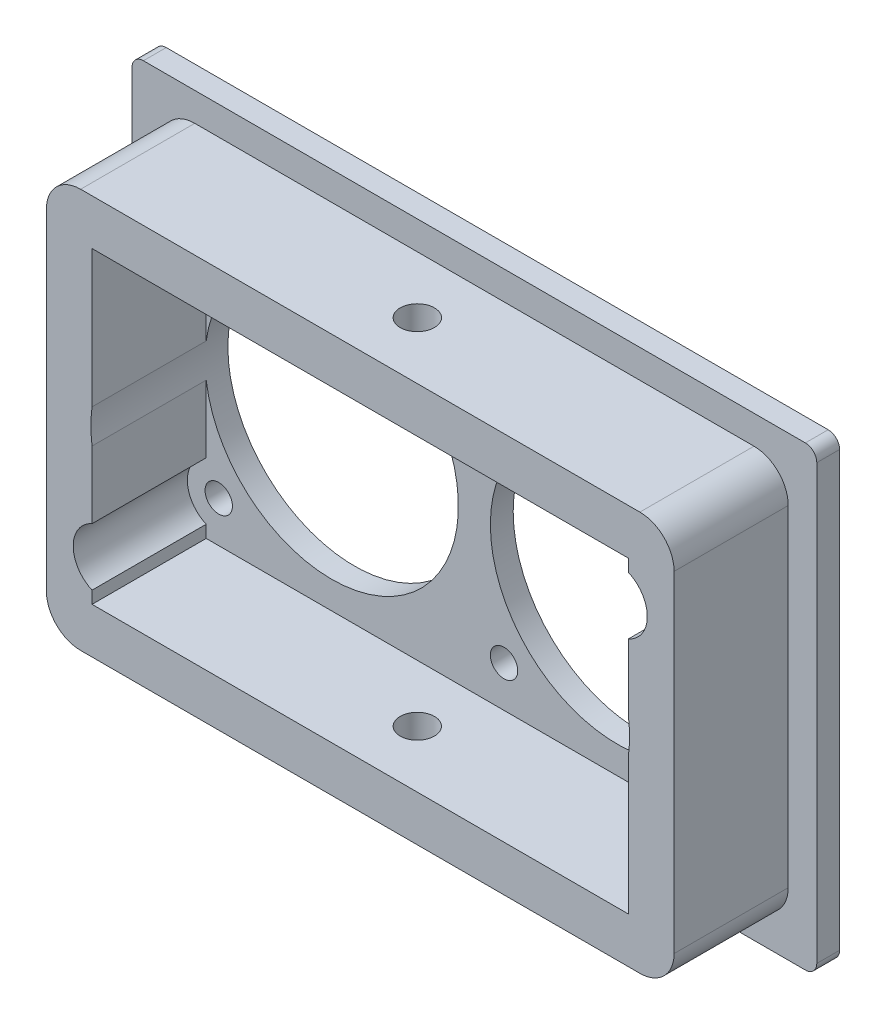
ISO-10303-21;
HEADER;
FILE_DESCRIPTION(('STEP AP214'),'2;1');
FILE_NAME('part.step','',(''),(''),'','','');
FILE_SCHEMA(('AUTOMOTIVE_DESIGN { 1 0 10303 214 1 1 1 1 }'));
ENDSEC;
DATA;
#1=APPLICATION_CONTEXT('core data for automotive mechanical design processes');
#2=APPLICATION_PROTOCOL_DEFINITION('international standard','automotive_design',2000,#1);
#3=PRODUCT_CONTEXT('',#1,'mechanical');
#4=PRODUCT('Part','Part','',(#3));
#5=PRODUCT_RELATED_PRODUCT_CATEGORY('part','',(#4));
#6=PRODUCT_DEFINITION_FORMATION('','',#4);
#7=PRODUCT_DEFINITION_CONTEXT('part definition',#1,'design');
#8=PRODUCT_DEFINITION('design','',#6,#7);
#9=PRODUCT_DEFINITION_SHAPE('','',#8);
#10=(LENGTH_UNIT() NAMED_UNIT(*) SI_UNIT(.MILLI.,.METRE.));
#11=(NAMED_UNIT(*) PLANE_ANGLE_UNIT() SI_UNIT($,.RADIAN.));
#12=(NAMED_UNIT(*) SI_UNIT($,.STERADIAN.) SOLID_ANGLE_UNIT());
#13=UNCERTAINTY_MEASURE_WITH_UNIT(LENGTH_MEASURE(1.E-05),#10,'distance_accuracy_value','');
#14=(GEOMETRIC_REPRESENTATION_CONTEXT(3) GLOBAL_UNCERTAINTY_ASSIGNED_CONTEXT((#13)) GLOBAL_UNIT_ASSIGNED_CONTEXT((#10,
#11,#12)) REPRESENTATION_CONTEXT('',''));
#15=CARTESIAN_POINT('',(0.,0.,0.));
#16=DIRECTION('',(0.,0.,1.));
#17=DIRECTION('',(1.,0.,0.));
#18=AXIS2_PLACEMENT_3D('',#15,#16,#17);
#19=CARTESIAN_POINT('',(6.5,33.5,-52.2033209314706));
#20=DIRECTION('',(-1.,0.,0.));
#21=DIRECTION('',(0.,0.,1.));
#22=AXIS2_PLACEMENT_3D('',#19,#20,#21);
#23=PLANE('',#22);
#24=DIRECTION('',(0.,0.,-1.));
#25=VECTOR('',#24,1.);
#26=CARTESIAN_POINT('',(6.5,12.6204166322257,12.));
#27=LINE('',#26,#25);
#28=CARTESIAN_POINT('',(6.5,12.6204166322257,2.));
#29=VERTEX_POINT('',#28);
#30=CARTESIAN_POINT('',(6.5,12.6204166322257,12.));
#31=VERTEX_POINT('',#30);
#32=EDGE_CURVE('E225',#29,#31,#27,.F.);
#33=ORIENTED_EDGE('',*,*,#32,.F.);
#34=DIRECTION('',(0.,-1.,0.));
#35=VECTOR('',#34,1.);
#36=CARTESIAN_POINT('',(6.5,33.5,2.));
#37=LINE('',#36,#35);
#38=CARTESIAN_POINT('',(6.5,18.5133931252681,2.));
#39=VERTEX_POINT('',#38);
#40=EDGE_CURVE('E238',#39,#29,#37,.T.);
#41=ORIENTED_EDGE('',*,*,#40,.F.);
#42=DIRECTION('',(0.,0.,-1.));
#43=VECTOR('',#42,1.);
#44=CARTESIAN_POINT('',(6.5,18.5133931252681,12.));
#45=LINE('',#44,#43);
#46=CARTESIAN_POINT('',(6.5,18.5133931252681,12.));
#47=VERTEX_POINT('',#46);
#48=EDGE_CURVE('E459',#39,#47,#45,.F.);
#49=ORIENTED_EDGE('',*,*,#48,.T.);
#50=DIRECTION('',(0.,-1.,0.));
#51=VECTOR('',#50,1.);
#52=CARTESIAN_POINT('',(6.5,33.5,12.));
#53=LINE('',#52,#51);
#54=EDGE_CURVE('E240',#47,#31,#53,.T.);
#55=ORIENTED_EDGE('',*,*,#54,.T.);
#56=EDGE_LOOP('',(#33,#41,#49,#55));
#57=FACE_BOUND('',#56,.T.);
#58=ADVANCED_FACE('F38',(#57),#23,.F.);
#59=CARTESIAN_POINT('',(53.5,6.5,-52.2033209314706));
#60=DIRECTION('',(1.,0.,0.));
#61=DIRECTION('',(0.,0.,-1.));
#62=AXIS2_PLACEMENT_3D('',#59,#60,#61);
#63=PLANE('',#62);
#64=DIRECTION('',(0.,0.,-1.));
#65=VECTOR('',#64,1.);
#66=CARTESIAN_POINT('',(53.5,27.3795833677743,12.));
#67=LINE('',#66,#65);
#68=CARTESIAN_POINT('',(53.5,27.3795833677743,2.));
#69=VERTEX_POINT('',#68);
#70=CARTESIAN_POINT('',(53.5,27.3795833677743,12.));
#71=VERTEX_POINT('',#70);
#72=EDGE_CURVE('E243',#69,#71,#67,.F.);
#73=ORIENTED_EDGE('',*,*,#72,.F.);
#74=DIRECTION('',(0.,1.,0.));
#75=VECTOR('',#74,1.);
#76=CARTESIAN_POINT('',(53.5,6.5,2.));
#77=LINE('',#76,#75);
#78=CARTESIAN_POINT('',(53.5,21.4866068747319,2.));
#79=VERTEX_POINT('',#78);
#80=EDGE_CURVE('E489',#79,#69,#77,.T.);
#81=ORIENTED_EDGE('',*,*,#80,.F.);
#82=DIRECTION('',(0.,0.,-1.));
#83=VECTOR('',#82,1.);
#84=CARTESIAN_POINT('',(53.5,21.4866068747319,12.));
#85=LINE('',#84,#83);
#86=CARTESIAN_POINT('',(53.5,21.4866068747319,12.));
#87=VERTEX_POINT('',#86);
#88=EDGE_CURVE('E446',#79,#87,#85,.F.);
#89=ORIENTED_EDGE('',*,*,#88,.T.);
#90=DIRECTION('',(0.,1.,0.));
#91=VECTOR('',#90,1.);
#92=CARTESIAN_POINT('',(53.5,6.5,12.));
#93=LINE('',#92,#91);
#94=EDGE_CURVE('E532',#87,#71,#93,.T.);
#95=ORIENTED_EDGE('',*,*,#94,.T.);
#96=EDGE_LOOP('',(#73,#81,#89,#95));
#97=FACE_BOUND('',#96,.T.);
#98=ADVANCED_FACE('F655',(#97),#63,.F.);
#99=DIRECTION('',(0.,0.,-1.));
#100=VECTOR('',#99,1.);
#101=CARTESIAN_POINT('',(6.5,7.57958336777431,12.));
#102=LINE('',#101,#100);
#103=CARTESIAN_POINT('',(6.5,7.57958336777431,12.));
#104=VERTEX_POINT('',#103);
#105=CARTESIAN_POINT('',(6.5,7.57958336777431,2.));
#106=VERTEX_POINT('',#105);
#107=EDGE_CURVE('E11',#104,#106,#102,.T.);
#108=ORIENTED_EDGE('',*,*,#107,.F.);
#109=CARTESIAN_POINT('',(6.5,6.5,12.));
#110=VERTEX_POINT('',#109);
#111=EDGE_CURVE('E521',#104,#110,#53,.T.);
#112=ORIENTED_EDGE('',*,*,#111,.T.);
#113=DIRECTION('',(0.,0.,1.));
#114=VECTOR('',#113,1.);
#115=CARTESIAN_POINT('',(6.5,6.5,-52.2033209314706));
#116=LINE('',#115,#114);
#117=CARTESIAN_POINT('',(6.5,6.5,2.));
#118=VERTEX_POINT('',#117);
#119=EDGE_CURVE('E256',#118,#110,#116,.T.);
#120=ORIENTED_EDGE('',*,*,#119,.F.);
#121=EDGE_CURVE('E252',#106,#118,#37,.T.);
#122=ORIENTED_EDGE('',*,*,#121,.F.);
#123=EDGE_LOOP('',(#108,#112,#120,#122));
#124=FACE_BOUND('',#123,.T.);
#125=ADVANCED_FACE('F594',(#124),#23,.F.);
#126=DIRECTION('',(0.,0.,-1.));
#127=VECTOR('',#126,1.);
#128=CARTESIAN_POINT('',(53.5,32.4204166322257,12.));
#129=LINE('',#128,#127);
#130=CARTESIAN_POINT('',(53.5,32.4204166322257,12.));
#131=VERTEX_POINT('',#130);
#132=CARTESIAN_POINT('',(53.5,32.4204166322257,2.));
#133=VERTEX_POINT('',#132);
#134=EDGE_CURVE('E47',#131,#133,#129,.T.);
#135=ORIENTED_EDGE('',*,*,#134,.F.);
#136=CARTESIAN_POINT('',(53.5,33.5,12.));
#137=VERTEX_POINT('',#136);
#138=EDGE_CURVE('E533',#131,#137,#93,.T.);
#139=ORIENTED_EDGE('',*,*,#138,.T.);
#140=DIRECTION('',(0.,0.,1.));
#141=VECTOR('',#140,1.);
#142=CARTESIAN_POINT('',(53.5,33.5,-52.2033209314706));
#143=LINE('',#142,#141);
#144=CARTESIAN_POINT('',(53.5,33.5,2.));
#145=VERTEX_POINT('',#144);
#146=EDGE_CURVE('E273',#145,#137,#143,.T.);
#147=ORIENTED_EDGE('',*,*,#146,.F.);
#148=EDGE_CURVE('E266',#133,#145,#77,.T.);
#149=ORIENTED_EDGE('',*,*,#148,.F.);
#150=EDGE_LOOP('',(#135,#139,#147,#149));
#151=FACE_BOUND('',#150,.T.);
#152=ADVANCED_FACE('F493',(#151),#63,.F.);
#153=CARTESIAN_POINT('',(52.4,29.9,12.));
#154=DIRECTION('',(0.,0.,-1.));
#155=DIRECTION('',(-1.,0.,0.));
#156=AXIS2_PLACEMENT_3D('',#153,#154,#155);
#157=CYLINDRICAL_SURFACE('',#156,1.2);
#158=CARTESIAN_POINT('',(52.4,29.9,0.));
#159=DIRECTION('',(0.,0.,-1.));
#160=DIRECTION('',(-1.,0.,0.));
#161=AXIS2_PLACEMENT_3D('',#158,#159,#160);
#162=CIRCLE('',#161,1.2);
#163=CARTESIAN_POINT('',(51.2,29.9,0.));
#164=VERTEX_POINT('',#163);
#165=EDGE_CURVE('E567',#164,#164,#162,.T.);
#166=ORIENTED_EDGE('',*,*,#165,.T.);
#167=EDGE_LOOP('',(#166));
#168=FACE_BOUND('',#167,.T.);
#169=CARTESIAN_POINT('',(52.4,29.9,2.));
#170=DIRECTION('',(0.,0.,-1.));
#171=DIRECTION('',(-1.,0.,0.));
#172=AXIS2_PLACEMENT_3D('',#169,#170,#171);
#173=CIRCLE('',#172,1.2);
#174=CARTESIAN_POINT('',(51.2,29.9,2.));
#175=VERTEX_POINT('',#174);
#176=EDGE_CURVE('E555',#175,#175,#173,.T.);
#177=ORIENTED_EDGE('',*,*,#176,.F.);
#178=EDGE_LOOP('',(#177));
#179=FACE_BOUND('',#178,.T.);
#180=ADVANCED_FACE('F675',(#168,#179),#157,.F.);
#181=CARTESIAN_POINT('',(7.60000000000004,10.1,12.));
#182=DIRECTION('',(0.,0.,-1.));
#183=DIRECTION('',(-1.,0.,0.));
#184=AXIS2_PLACEMENT_3D('',#181,#182,#183);
#185=CYLINDRICAL_SURFACE('',#184,1.2);
#186=CARTESIAN_POINT('',(7.60000000000004,10.1,0.));
#187=DIRECTION('',(0.,0.,-1.));
#188=DIRECTION('',(-1.,0.,0.));
#189=AXIS2_PLACEMENT_3D('',#186,#187,#188);
#190=CIRCLE('',#189,1.2);
#191=CARTESIAN_POINT('',(6.40000000000004,10.1,0.));
#192=VERTEX_POINT('',#191);
#193=EDGE_CURVE('E242',#192,#192,#190,.T.);
#194=ORIENTED_EDGE('',*,*,#193,.T.);
#195=EDGE_LOOP('',(#194));
#196=FACE_BOUND('',#195,.T.);
#197=CARTESIAN_POINT('',(7.60000000000004,10.1,2.));
#198=DIRECTION('',(0.,0.,-1.));
#199=DIRECTION('',(-1.,0.,0.));
#200=AXIS2_PLACEMENT_3D('',#197,#198,#199);
#201=CIRCLE('',#200,1.2);
#202=CARTESIAN_POINT('',(6.40000000000004,10.1,2.));
#203=VERTEX_POINT('',#202);
#204=EDGE_CURVE('E551',#203,#203,#201,.T.);
#205=ORIENTED_EDGE('',*,*,#204,.F.);
#206=EDGE_LOOP('',(#205));
#207=FACE_BOUND('',#206,.T.);
#208=ADVANCED_FACE('F668',(#196,#207),#185,.F.);
#209=CARTESIAN_POINT('',(6.5,33.5,12.));
#210=VERTEX_POINT('',#209);
#211=CARTESIAN_POINT('',(6.5,21.4866068747319,12.));
#212=VERTEX_POINT('',#211);
#213=EDGE_CURVE('E515',#210,#212,#53,.T.);
#214=ORIENTED_EDGE('',*,*,#213,.T.);
#215=DIRECTION('',(0.,0.,-1.));
#216=VECTOR('',#215,1.);
#217=CARTESIAN_POINT('',(6.5,21.4866068747319,12.));
#218=LINE('',#217,#216);
#219=CARTESIAN_POINT('',(6.5,21.4866068747319,2.));
#220=VERTEX_POINT('',#219);
#221=EDGE_CURVE('E462',#212,#220,#218,.T.);
#222=ORIENTED_EDGE('',*,*,#221,.T.);
#223=CARTESIAN_POINT('',(6.5,33.5,2.));
#224=VERTEX_POINT('',#223);
#225=EDGE_CURVE('E251',#224,#220,#37,.T.);
#226=ORIENTED_EDGE('',*,*,#225,.F.);
#227=DIRECTION('',(0.,0.,1.));
#228=VECTOR('',#227,1.);
#229=CARTESIAN_POINT('',(6.5,33.5,-52.2033209314706));
#230=LINE('',#229,#228);
#231=EDGE_CURVE('E257',#224,#210,#230,.T.);
#232=ORIENTED_EDGE('',*,*,#231,.T.);
#233=EDGE_LOOP('',(#214,#222,#226,#232));
#234=FACE_BOUND('',#233,.T.);
#235=ADVANCED_FACE('F657',(#234),#23,.F.);
#236=CARTESIAN_POINT('',(53.5,6.5,12.));
#237=VERTEX_POINT('',#236);
#238=CARTESIAN_POINT('',(53.5,18.5133931252681,12.));
#239=VERTEX_POINT('',#238);
#240=EDGE_CURVE('E530',#237,#239,#93,.T.);
#241=ORIENTED_EDGE('',*,*,#240,.T.);
#242=DIRECTION('',(0.,0.,-1.));
#243=VECTOR('',#242,1.);
#244=CARTESIAN_POINT('',(53.5,18.5133931252681,12.));
#245=LINE('',#244,#243);
#246=CARTESIAN_POINT('',(53.5,18.5133931252681,2.));
#247=VERTEX_POINT('',#246);
#248=EDGE_CURVE('E455',#239,#247,#245,.T.);
#249=ORIENTED_EDGE('',*,*,#248,.T.);
#250=CARTESIAN_POINT('',(53.5,6.5,2.));
#251=VERTEX_POINT('',#250);
#252=EDGE_CURVE('E278',#251,#247,#77,.T.);
#253=ORIENTED_EDGE('',*,*,#252,.F.);
#254=DIRECTION('',(0.,0.,1.));
#255=VECTOR('',#254,1.);
#256=CARTESIAN_POINT('',(53.5,6.5,-52.2033209314706));
#257=LINE('',#256,#255);
#258=EDGE_CURVE('E262',#251,#237,#257,.T.);
#259=ORIENTED_EDGE('',*,*,#258,.T.);
#260=EDGE_LOOP('',(#241,#249,#253,#259));
#261=FACE_BOUND('',#260,.T.);
#262=ADVANCED_FACE('F505',(#261),#63,.F.);
#263=CARTESIAN_POINT('',(0.,0.,2.));
#264=DIRECTION('',(0.,0.,-1.));
#265=DIRECTION('',(-1.,0.,0.));
#266=AXIS2_PLACEMENT_3D('',#263,#264,#265);
#267=PLANE('',#266);
#268=DIRECTION('',(0.,-1.,0.));
#269=VECTOR('',#268,1.);
#270=CARTESIAN_POINT('',(0.,0.,2.));
#271=LINE('',#270,#269);
#272=CARTESIAN_POINT('',(0.,39.,2.));
#273=VERTEX_POINT('',#272);
#274=CARTESIAN_POINT('',(0.,1.,2.));
#275=VERTEX_POINT('',#274);
#276=EDGE_CURVE('E311',#273,#275,#271,.T.);
#277=ORIENTED_EDGE('',*,*,#276,.T.);
#278=CARTESIAN_POINT('',(1.,1.,2.));
#279=DIRECTION('',(0.,0.,-1.));
#280=DIRECTION('',(-1.,0.,0.));
#281=AXIS2_PLACEMENT_3D('',#278,#279,#280);
#282=CIRCLE('',#281,1.);
#283=CARTESIAN_POINT('',(1.,0.,2.));
#284=VERTEX_POINT('',#283);
#285=EDGE_CURVE('E429',#275,#284,#282,.F.);
#286=ORIENTED_EDGE('',*,*,#285,.T.);
#287=DIRECTION('',(1.,0.,0.));
#288=VECTOR('',#287,1.);
#289=CARTESIAN_POINT('',(0.,0.,2.));
#290=LINE('',#289,#288);
#291=CARTESIAN_POINT('',(59.,0.,2.));
#292=VERTEX_POINT('',#291);
#293=EDGE_CURVE('E315',#284,#292,#290,.T.);
#294=ORIENTED_EDGE('',*,*,#293,.T.);
#295=CARTESIAN_POINT('',(59.,1.,2.));
#296=DIRECTION('',(0.,0.,-1.));
#297=DIRECTION('',(-1.,0.,0.));
#298=AXIS2_PLACEMENT_3D('',#295,#296,#297);
#299=CIRCLE('',#298,1.);
#300=CARTESIAN_POINT('',(60.,1.,2.));
#301=VERTEX_POINT('',#300);
#302=EDGE_CURVE('E426',#292,#301,#299,.F.);
#303=ORIENTED_EDGE('',*,*,#302,.T.);
#304=DIRECTION('',(0.,1.,0.));
#305=VECTOR('',#304,1.);
#306=CARTESIAN_POINT('',(60.,0.,2.));
#307=LINE('',#306,#305);
#308=CARTESIAN_POINT('',(60.,39.,2.));
#309=VERTEX_POINT('',#308);
#310=EDGE_CURVE('E320',#301,#309,#307,.T.);
#311=ORIENTED_EDGE('',*,*,#310,.T.);
#312=CARTESIAN_POINT('',(59.,39.,2.));
#313=DIRECTION('',(0.,0.,-1.));
#314=DIRECTION('',(-1.,0.,0.));
#315=AXIS2_PLACEMENT_3D('',#312,#313,#314);
#316=CIRCLE('',#315,1.);
#317=CARTESIAN_POINT('',(59.,40.,2.));
#318=VERTEX_POINT('',#317);
#319=EDGE_CURVE('E423',#309,#318,#316,.F.);
#320=ORIENTED_EDGE('',*,*,#319,.T.);
#321=DIRECTION('',(-1.,0.,0.));
#322=VECTOR('',#321,1.);
#323=CARTESIAN_POINT('',(0.,40.,2.));
#324=LINE('',#323,#322);
#325=CARTESIAN_POINT('',(1.,40.,2.));
#326=VERTEX_POINT('',#325);
#327=EDGE_CURVE('E324',#318,#326,#324,.T.);
#328=ORIENTED_EDGE('',*,*,#327,.T.);
#329=CARTESIAN_POINT('',(1.,39.,2.));
#330=DIRECTION('',(0.,0.,-1.));
#331=DIRECTION('',(-1.,0.,0.));
#332=AXIS2_PLACEMENT_3D('',#329,#330,#331);
#333=CIRCLE('',#332,1.);
#334=EDGE_CURVE('E420',#326,#273,#333,.F.);
#335=ORIENTED_EDGE('',*,*,#334,.T.);
#336=EDGE_LOOP('',(#277,#286,#294,#303,#311,#320,#328,#335));
#337=FACE_BOUND('',#336,.T.);
#338=DIRECTION('',(-1.,0.,0.));
#339=VECTOR('',#338,1.);
#340=CARTESIAN_POINT('',(57.5,37.5,2.));
#341=LINE('',#340,#339);
#342=CARTESIAN_POINT('',(54.5,37.5,2.));
#343=VERTEX_POINT('',#342);
#344=CARTESIAN_POINT('',(5.5,37.5,2.));
#345=VERTEX_POINT('',#344);
#346=EDGE_CURVE('E277',#343,#345,#341,.T.);
#347=ORIENTED_EDGE('',*,*,#346,.F.);
#348=CARTESIAN_POINT('',(54.5,34.5,2.));
#349=DIRECTION('',(0.,0.,-1.));
#350=DIRECTION('',(-1.,0.,0.));
#351=AXIS2_PLACEMENT_3D('',#348,#349,#350);
#352=CIRCLE('',#351,3.);
#353=CARTESIAN_POINT('',(57.5,34.5,2.));
#354=VERTEX_POINT('',#353);
#355=EDGE_CURVE('E391',#343,#354,#352,.T.);
#356=ORIENTED_EDGE('',*,*,#355,.T.);
#357=DIRECTION('',(0.,1.,0.));
#358=VECTOR('',#357,1.);
#359=CARTESIAN_POINT('',(57.5,2.5,2.));
#360=LINE('',#359,#358);
#361=CARTESIAN_POINT('',(57.5,5.5,2.));
#362=VERTEX_POINT('',#361);
#363=EDGE_CURVE('E284',#362,#354,#360,.T.);
#364=ORIENTED_EDGE('',*,*,#363,.F.);
#365=CARTESIAN_POINT('',(54.5,5.5,2.));
#366=DIRECTION('',(0.,0.,-1.));
#367=DIRECTION('',(-1.,0.,0.));
#368=AXIS2_PLACEMENT_3D('',#365,#366,#367);
#369=CIRCLE('',#368,3.);
#370=CARTESIAN_POINT('',(54.5,2.5,2.));
#371=VERTEX_POINT('',#370);
#372=EDGE_CURVE('E388',#362,#371,#369,.T.);
#373=ORIENTED_EDGE('',*,*,#372,.T.);
#374=DIRECTION('',(1.,0.,0.));
#375=VECTOR('',#374,1.);
#376=CARTESIAN_POINT('',(2.5,2.5,2.));
#377=LINE('',#376,#375);
#378=CARTESIAN_POINT('',(5.5,2.5,2.));
#379=VERTEX_POINT('',#378);
#380=EDGE_CURVE('E304',#379,#371,#377,.T.);
#381=ORIENTED_EDGE('',*,*,#380,.F.);
#382=CARTESIAN_POINT('',(5.5,5.5,2.));
#383=DIRECTION('',(0.,0.,-1.));
#384=DIRECTION('',(-1.,0.,0.));
#385=AXIS2_PLACEMENT_3D('',#382,#383,#384);
#386=CIRCLE('',#385,3.);
#387=CARTESIAN_POINT('',(2.5,5.5,2.));
#388=VERTEX_POINT('',#387);
#389=EDGE_CURVE('E385',#379,#388,#386,.T.);
#390=ORIENTED_EDGE('',*,*,#389,.T.);
#391=DIRECTION('',(0.,-1.,0.));
#392=VECTOR('',#391,1.);
#393=CARTESIAN_POINT('',(2.5,37.5,2.));
#394=LINE('',#393,#392);
#395=CARTESIAN_POINT('',(2.5,34.5,2.));
#396=VERTEX_POINT('',#395);
#397=EDGE_CURVE('E300',#396,#388,#394,.T.);
#398=ORIENTED_EDGE('',*,*,#397,.F.);
#399=CARTESIAN_POINT('',(5.5,34.5,2.));
#400=DIRECTION('',(0.,0.,-1.));
#401=DIRECTION('',(-1.,0.,0.));
#402=AXIS2_PLACEMENT_3D('',#399,#400,#401);
#403=CIRCLE('',#402,3.);
#404=EDGE_CURVE('E382',#396,#345,#403,.T.);
#405=ORIENTED_EDGE('',*,*,#404,.T.);
#406=EDGE_LOOP('',(#347,#356,#364,#373,#381,#390,#398,#405));
#407=FACE_BOUND('',#406,.T.);
#408=ADVANCED_FACE('F618',(#337,#407),#267,.F.);
#409=CARTESIAN_POINT('',(0.,0.,2.));
#410=DIRECTION('',(1.,0.,0.));
#411=DIRECTION('',(0.,0.,-1.));
#412=AXIS2_PLACEMENT_3D('',#409,#410,#411);
#413=PLANE('',#412);
#414=DIRECTION('',(0.,-1.,0.));
#415=VECTOR('',#414,1.);
#416=CARTESIAN_POINT('',(0.,0.,0.));
#417=LINE('',#416,#415);
#418=CARTESIAN_POINT('',(0.,39.,0.));
#419=VERTEX_POINT('',#418);
#420=CARTESIAN_POINT('',(0.,1.,0.));
#421=VERTEX_POINT('',#420);
#422=EDGE_CURVE('E296',#419,#421,#417,.T.);
#423=ORIENTED_EDGE('',*,*,#422,.T.);
#424=DIRECTION('',(0.,0.,-1.));
#425=VECTOR('',#424,1.);
#426=CARTESIAN_POINT('',(0.,1.,2.));
#427=LINE('',#426,#425);
#428=EDGE_CURVE('E417',#421,#275,#427,.F.);
#429=ORIENTED_EDGE('',*,*,#428,.T.);
#430=ORIENTED_EDGE('',*,*,#276,.F.);
#431=DIRECTION('',(0.,0.,-1.));
#432=VECTOR('',#431,1.);
#433=CARTESIAN_POINT('',(0.,39.,2.));
#434=LINE('',#433,#432);
#435=EDGE_CURVE('E413',#273,#419,#434,.T.);
#436=ORIENTED_EDGE('',*,*,#435,.T.);
#437=EDGE_LOOP('',(#423,#429,#430,#436));
#438=FACE_BOUND('',#437,.T.);
#439=ADVANCED_FACE('F787',(#438),#413,.F.);
#440=CARTESIAN_POINT('',(0.,0.,2.));
#441=DIRECTION('',(0.,1.,0.));
#442=DIRECTION('',(0.,0.,1.));
#443=AXIS2_PLACEMENT_3D('',#440,#441,#442);
#444=PLANE('',#443);
#445=ORIENTED_EDGE('',*,*,#293,.F.);
#446=DIRECTION('',(0.,0.,-1.));
#447=VECTOR('',#446,1.);
#448=CARTESIAN_POINT('',(1.,0.,2.));
#449=LINE('',#448,#447);
#450=CARTESIAN_POINT('',(1.,0.,0.));
#451=VERTEX_POINT('',#450);
#452=EDGE_CURVE('E397',#284,#451,#449,.T.);
#453=ORIENTED_EDGE('',*,*,#452,.T.);
#454=DIRECTION('',(1.,0.,0.));
#455=VECTOR('',#454,1.);
#456=CARTESIAN_POINT('',(0.,0.,0.));
#457=LINE('',#456,#455);
#458=CARTESIAN_POINT('',(59.,0.,0.));
#459=VERTEX_POINT('',#458);
#460=EDGE_CURVE('E332',#451,#459,#457,.T.);
#461=ORIENTED_EDGE('',*,*,#460,.T.);
#462=DIRECTION('',(0.,0.,-1.));
#463=VECTOR('',#462,1.);
#464=CARTESIAN_POINT('',(59.,0.,2.));
#465=LINE('',#464,#463);
#466=EDGE_CURVE('E394',#459,#292,#465,.F.);
#467=ORIENTED_EDGE('',*,*,#466,.T.);
#468=EDGE_LOOP('',(#445,#453,#461,#467));
#469=FACE_BOUND('',#468,.T.);
#470=ADVANCED_FACE('F808',(#469),#444,.F.);
#471=CARTESIAN_POINT('',(60.,0.,2.));
#472=DIRECTION('',(-1.,0.,0.));
#473=DIRECTION('',(0.,0.,1.));
#474=AXIS2_PLACEMENT_3D('',#471,#472,#473);
#475=PLANE('',#474);
#476=ORIENTED_EDGE('',*,*,#310,.F.);
#477=DIRECTION('',(0.,0.,-1.));
#478=VECTOR('',#477,1.);
#479=CARTESIAN_POINT('',(60.,1.,2.));
#480=LINE('',#479,#478);
#481=CARTESIAN_POINT('',(60.,1.,0.));
#482=VERTEX_POINT('',#481);
#483=EDGE_CURVE('E435',#301,#482,#480,.T.);
#484=ORIENTED_EDGE('',*,*,#483,.T.);
#485=DIRECTION('',(0.,1.,0.));
#486=VECTOR('',#485,1.);
#487=CARTESIAN_POINT('',(60.,0.,0.));
#488=LINE('',#487,#486);
#489=CARTESIAN_POINT('',(60.,39.,0.));
#490=VERTEX_POINT('',#489);
#491=EDGE_CURVE('E336',#482,#490,#488,.T.);
#492=ORIENTED_EDGE('',*,*,#491,.T.);
#493=DIRECTION('',(0.,0.,-1.));
#494=VECTOR('',#493,1.);
#495=CARTESIAN_POINT('',(60.,39.,2.));
#496=LINE('',#495,#494);
#497=EDGE_CURVE('E432',#490,#309,#496,.F.);
#498=ORIENTED_EDGE('',*,*,#497,.T.);
#499=EDGE_LOOP('',(#476,#484,#492,#498));
#500=FACE_BOUND('',#499,.T.);
#501=ADVANCED_FACE('F799',(#500),#475,.F.);
#502=CARTESIAN_POINT('',(0.,40.,2.));
#503=DIRECTION('',(0.,-1.,0.));
#504=DIRECTION('',(0.,0.,-1.));
#505=AXIS2_PLACEMENT_3D('',#502,#503,#504);
#506=PLANE('',#505);
#507=ORIENTED_EDGE('',*,*,#327,.F.);
#508=DIRECTION('',(0.,0.,-1.));
#509=VECTOR('',#508,1.);
#510=CARTESIAN_POINT('',(59.,40.,2.));
#511=LINE('',#510,#509);
#512=CARTESIAN_POINT('',(59.,40.,0.));
#513=VERTEX_POINT('',#512);
#514=EDGE_CURVE('E442',#318,#513,#511,.T.);
#515=ORIENTED_EDGE('',*,*,#514,.T.);
#516=DIRECTION('',(-1.,0.,0.));
#517=VECTOR('',#516,1.);
#518=CARTESIAN_POINT('',(0.,40.,0.));
#519=LINE('',#518,#517);
#520=CARTESIAN_POINT('',(1.,40.,0.));
#521=VERTEX_POINT('',#520);
#522=EDGE_CURVE('E316',#513,#521,#519,.T.);
#523=ORIENTED_EDGE('',*,*,#522,.T.);
#524=DIRECTION('',(0.,0.,-1.));
#525=VECTOR('',#524,1.);
#526=CARTESIAN_POINT('',(1.,40.,2.));
#527=LINE('',#526,#525);
#528=EDGE_CURVE('E439',#521,#326,#527,.F.);
#529=ORIENTED_EDGE('',*,*,#528,.T.);
#530=EDGE_LOOP('',(#507,#515,#523,#529));
#531=FACE_BOUND('',#530,.T.);
#532=ADVANCED_FACE('F649',(#531),#506,.F.);
#533=CARTESIAN_POINT('',(0.,0.,0.));
#534=DIRECTION('',(0.,0.,-1.));
#535=DIRECTION('',(-1.,0.,0.));
#536=AXIS2_PLACEMENT_3D('',#533,#534,#535);
#537=PLANE('',#536);
#538=CARTESIAN_POINT('',(27.4,29.9,0.));
#539=DIRECTION('',(0.,0.,-1.));
#540=DIRECTION('',(-1.,0.,0.));
#541=AXIS2_PLACEMENT_3D('',#538,#539,#540);
#542=CIRCLE('',#541,1.2);
#543=CARTESIAN_POINT('',(26.2,29.9,0.));
#544=VERTEX_POINT('',#543);
#545=EDGE_CURVE('E578',#544,#544,#542,.T.);
#546=ORIENTED_EDGE('',*,*,#545,.F.);
#547=EDGE_LOOP('',(#546));
#548=FACE_BOUND('',#547,.T.);
#549=CARTESIAN_POINT('',(32.6,10.1,0.));
#550=DIRECTION('',(0.,0.,-1.));
#551=DIRECTION('',(-1.,0.,0.));
#552=AXIS2_PLACEMENT_3D('',#549,#550,#551);
#553=CIRCLE('',#552,1.2);
#554=CARTESIAN_POINT('',(31.4,10.1,0.));
#555=VERTEX_POINT('',#554);
#556=EDGE_CURVE('E572',#555,#555,#553,.T.);
#557=ORIENTED_EDGE('',*,*,#556,.F.);
#558=EDGE_LOOP('',(#557));
#559=FACE_BOUND('',#558,.T.);
#560=ORIENTED_EDGE('',*,*,#165,.F.);
#561=EDGE_LOOP('',(#560));
#562=FACE_BOUND('',#561,.T.);
#563=CARTESIAN_POINT('',(17.5,20.,0.));
#564=DIRECTION('',(0.,0.,-1.));
#565=DIRECTION('',(-1.,0.,0.));
#566=AXIS2_PLACEMENT_3D('',#563,#564,#565);
#567=CIRCLE('',#566,11.1);
#568=CARTESIAN_POINT('',(6.4,20.,0.));
#569=VERTEX_POINT('',#568);
#570=EDGE_CURVE('E571',#569,#569,#567,.T.);
#571=ORIENTED_EDGE('',*,*,#570,.F.);
#572=EDGE_LOOP('',(#571));
#573=FACE_BOUND('',#572,.T.);
#574=ORIENTED_EDGE('',*,*,#193,.F.);
#575=EDGE_LOOP('',(#574));
#576=FACE_BOUND('',#575,.T.);
#577=CARTESIAN_POINT('',(42.5,20.,0.));
#578=DIRECTION('',(0.,0.,-1.));
#579=DIRECTION('',(-1.,0.,0.));
#580=AXIS2_PLACEMENT_3D('',#577,#578,#579);
#581=CIRCLE('',#580,11.1);
#582=CARTESIAN_POINT('',(31.4,20.,0.));
#583=VERTEX_POINT('',#582);
#584=EDGE_CURVE('E561',#583,#583,#581,.T.);
#585=ORIENTED_EDGE('',*,*,#584,.F.);
#586=EDGE_LOOP('',(#585));
#587=FACE_BOUND('',#586,.T.);
#588=ORIENTED_EDGE('',*,*,#460,.F.);
#589=CARTESIAN_POINT('',(1.,1.,0.));
#590=DIRECTION('',(0.,0.,-1.));
#591=DIRECTION('',(-1.,0.,0.));
#592=AXIS2_PLACEMENT_3D('',#589,#590,#591);
#593=CIRCLE('',#592,1.);
#594=EDGE_CURVE('E410',#451,#421,#593,.T.);
#595=ORIENTED_EDGE('',*,*,#594,.T.);
#596=ORIENTED_EDGE('',*,*,#422,.F.);
#597=CARTESIAN_POINT('',(1.,39.,0.));
#598=DIRECTION('',(0.,0.,-1.));
#599=DIRECTION('',(-1.,0.,0.));
#600=AXIS2_PLACEMENT_3D('',#597,#598,#599);
#601=CIRCLE('',#600,1.);
#602=EDGE_CURVE('E401',#419,#521,#601,.T.);
#603=ORIENTED_EDGE('',*,*,#602,.T.);
#604=ORIENTED_EDGE('',*,*,#522,.F.);
#605=CARTESIAN_POINT('',(59.,39.,0.));
#606=DIRECTION('',(0.,0.,-1.));
#607=DIRECTION('',(-1.,0.,0.));
#608=AXIS2_PLACEMENT_3D('',#605,#606,#607);
#609=CIRCLE('',#608,1.);
#610=EDGE_CURVE('E404',#513,#490,#609,.T.);
#611=ORIENTED_EDGE('',*,*,#610,.T.);
#612=ORIENTED_EDGE('',*,*,#491,.F.);
#613=CARTESIAN_POINT('',(59.,1.,0.));
#614=DIRECTION('',(0.,0.,-1.));
#615=DIRECTION('',(-1.,0.,0.));
#616=AXIS2_PLACEMENT_3D('',#613,#614,#615);
#617=CIRCLE('',#616,1.);
#618=EDGE_CURVE('E407',#482,#459,#617,.T.);
#619=ORIENTED_EDGE('',*,*,#618,.T.);
#620=EDGE_LOOP('',(#588,#595,#596,#603,#604,#611,#612,#619));
#621=FACE_BOUND('',#620,.T.);
#622=ADVANCED_FACE('F640',(#548,#559,#562,#573,#576,#587,#621),#537,.T.);
#623=CARTESIAN_POINT('',(57.5,37.5,12.));
#624=DIRECTION('',(0.,-1.,0.));
#625=DIRECTION('',(0.,0.,-1.));
#626=AXIS2_PLACEMENT_3D('',#623,#624,#625);
#627=PLANE('',#626);
#628=CARTESIAN_POINT('',(30.,37.5,7.00000000000001));
#629=DIRECTION('',(0.,1.,0.));
#630=DIRECTION('',(0.,0.,1.));
#631=AXIS2_PLACEMENT_3D('',#628,#629,#630);
#632=CIRCLE('',#631,1.5);
#633=CARTESIAN_POINT('',(30.,37.5,8.50000000000001));
#634=VERTEX_POINT('',#633);
#635=EDGE_CURVE('E452',#634,#634,#632,.T.);
#636=ORIENTED_EDGE('',*,*,#635,.F.);
#637=EDGE_LOOP('',(#636));
#638=FACE_BOUND('',#637,.T.);
#639=ORIENTED_EDGE('',*,*,#346,.T.);
#640=DIRECTION('',(0.,0.,-1.));
#641=VECTOR('',#640,1.);
#642=CARTESIAN_POINT('',(5.5,37.5,12.));
#643=LINE('',#642,#641);
#644=CARTESIAN_POINT('',(5.5,37.5,12.));
#645=VERTEX_POINT('',#644);
#646=EDGE_CURVE('E353',#345,#645,#643,.F.);
#647=ORIENTED_EDGE('',*,*,#646,.T.);
#648=DIRECTION('',(-1.,0.,0.));
#649=VECTOR('',#648,1.);
#650=CARTESIAN_POINT('',(57.5,37.5,12.));
#651=LINE('',#650,#649);
#652=CARTESIAN_POINT('',(54.5,37.5,12.));
#653=VERTEX_POINT('',#652);
#654=EDGE_CURVE('E279',#653,#645,#651,.T.);
#655=ORIENTED_EDGE('',*,*,#654,.F.);
#656=DIRECTION('',(0.,0.,-1.));
#657=VECTOR('',#656,1.);
#658=CARTESIAN_POINT('',(54.5,37.5,12.));
#659=LINE('',#658,#657);
#660=EDGE_CURVE('E349',#653,#343,#659,.T.);
#661=ORIENTED_EDGE('',*,*,#660,.T.);
#662=EDGE_LOOP('',(#639,#647,#655,#661));
#663=FACE_BOUND('',#662,.T.);
#664=ADVANCED_FACE('F638',(#638,#663),#627,.F.);
#665=CARTESIAN_POINT('',(2.5,37.5,12.));
#666=DIRECTION('',(1.,0.,0.));
#667=DIRECTION('',(0.,0.,-1.));
#668=AXIS2_PLACEMENT_3D('',#665,#666,#667);
#669=PLANE('',#668);
#670=DIRECTION('',(0.,-1.,0.));
#671=VECTOR('',#670,1.);
#672=CARTESIAN_POINT('',(2.5,37.5,12.));
#673=LINE('',#672,#671);
#674=CARTESIAN_POINT('',(2.5,34.5,12.));
#675=VERTEX_POINT('',#674);
#676=CARTESIAN_POINT('',(2.5,5.5,12.));
#677=VERTEX_POINT('',#676);
#678=EDGE_CURVE('E283',#675,#677,#673,.T.);
#679=ORIENTED_EDGE('',*,*,#678,.F.);
#680=DIRECTION('',(0.,0.,-1.));
#681=VECTOR('',#680,1.);
#682=CARTESIAN_POINT('',(2.5,34.5,12.));
#683=LINE('',#682,#681);
#684=EDGE_CURVE('E345',#675,#396,#683,.T.);
#685=ORIENTED_EDGE('',*,*,#684,.T.);
#686=ORIENTED_EDGE('',*,*,#397,.T.);
#687=DIRECTION('',(0.,0.,-1.));
#688=VECTOR('',#687,1.);
#689=CARTESIAN_POINT('',(2.5,5.5,12.));
#690=LINE('',#689,#688);
#691=EDGE_CURVE('E328',#388,#677,#690,.F.);
#692=ORIENTED_EDGE('',*,*,#691,.T.);
#693=EDGE_LOOP('',(#679,#685,#686,#692));
#694=FACE_BOUND('',#693,.T.);
#695=ADVANCED_FACE('F614',(#694),#669,.F.);
#696=CARTESIAN_POINT('',(2.5,2.5,12.));
#697=DIRECTION('',(0.,1.,0.));
#698=DIRECTION('',(0.,0.,1.));
#699=AXIS2_PLACEMENT_3D('',#696,#697,#698);
#700=PLANE('',#699);
#701=CARTESIAN_POINT('',(30.,2.5,7.00000000000001));
#702=DIRECTION('',(0.,1.,0.));
#703=DIRECTION('',(0.,0.,1.));
#704=AXIS2_PLACEMENT_3D('',#701,#702,#703);
#705=CIRCLE('',#704,1.5);
#706=CARTESIAN_POINT('',(30.,2.5,8.50000000000001));
#707=VERTEX_POINT('',#706);
#708=EDGE_CURVE('E523',#707,#707,#705,.T.);
#709=ORIENTED_EDGE('',*,*,#708,.T.);
#710=EDGE_LOOP('',(#709));
#711=FACE_BOUND('',#710,.T.);
#712=DIRECTION('',(1.,0.,0.));
#713=VECTOR('',#712,1.);
#714=CARTESIAN_POINT('',(2.5,2.5,12.));
#715=LINE('',#714,#713);
#716=CARTESIAN_POINT('',(5.5,2.5,12.));
#717=VERTEX_POINT('',#716);
#718=CARTESIAN_POINT('',(54.5,2.5,12.));
#719=VERTEX_POINT('',#718);
#720=EDGE_CURVE('E288',#717,#719,#715,.T.);
#721=ORIENTED_EDGE('',*,*,#720,.F.);
#722=DIRECTION('',(0.,0.,-1.));
#723=VECTOR('',#722,1.);
#724=CARTESIAN_POINT('',(5.5,2.5,12.));
#725=LINE('',#724,#723);
#726=EDGE_CURVE('E371',#717,#379,#725,.T.);
#727=ORIENTED_EDGE('',*,*,#726,.T.);
#728=ORIENTED_EDGE('',*,*,#380,.T.);
#729=DIRECTION('',(0.,0.,-1.));
#730=VECTOR('',#729,1.);
#731=CARTESIAN_POINT('',(54.5,2.5,12.));
#732=LINE('',#731,#730);
#733=EDGE_CURVE('E368',#371,#719,#732,.F.);
#734=ORIENTED_EDGE('',*,*,#733,.T.);
#735=EDGE_LOOP('',(#721,#727,#728,#734));
#736=FACE_BOUND('',#735,.T.);
#737=ADVANCED_FACE('F626',(#711,#736),#700,.F.);
#738=CARTESIAN_POINT('',(57.5,2.5,12.));
#739=DIRECTION('',(-1.,0.,0.));
#740=DIRECTION('',(0.,0.,1.));
#741=AXIS2_PLACEMENT_3D('',#738,#739,#740);
#742=PLANE('',#741);
#743=DIRECTION('',(0.,1.,0.));
#744=VECTOR('',#743,1.);
#745=CARTESIAN_POINT('',(57.5,2.5,12.));
#746=LINE('',#745,#744);
#747=CARTESIAN_POINT('',(57.5,5.5,12.));
#748=VERTEX_POINT('',#747);
#749=CARTESIAN_POINT('',(57.5,34.5,12.));
#750=VERTEX_POINT('',#749);
#751=EDGE_CURVE('E292',#748,#750,#746,.T.);
#752=ORIENTED_EDGE('',*,*,#751,.F.);
#753=DIRECTION('',(0.,0.,-1.));
#754=VECTOR('',#753,1.);
#755=CARTESIAN_POINT('',(57.5,5.5,12.));
#756=LINE('',#755,#754);
#757=EDGE_CURVE('E378',#748,#362,#756,.T.);
#758=ORIENTED_EDGE('',*,*,#757,.T.);
#759=ORIENTED_EDGE('',*,*,#363,.T.);
#760=DIRECTION('',(0.,0.,-1.));
#761=VECTOR('',#760,1.);
#762=CARTESIAN_POINT('',(57.5,34.5,12.));
#763=LINE('',#762,#761);
#764=EDGE_CURVE('E375',#354,#750,#763,.F.);
#765=ORIENTED_EDGE('',*,*,#764,.T.);
#766=EDGE_LOOP('',(#752,#758,#759,#765));
#767=FACE_BOUND('',#766,.T.);
#768=ADVANCED_FACE('F601',(#767),#742,.F.);
#769=CARTESIAN_POINT('',(0.,0.,12.));
#770=DIRECTION('',(0.,0.,1.));
#771=DIRECTION('',(1.,0.,0.));
#772=AXIS2_PLACEMENT_3D('',#769,#770,#771);
#773=PLANE('',#772);
#774=ORIENTED_EDGE('',*,*,#111,.F.);
#775=CARTESIAN_POINT('',(7.60000000000004,10.1,12.));
#776=DIRECTION('',(0.,0.,1.));
#777=DIRECTION('',(1.,0.,0.));
#778=AXIS2_PLACEMENT_3D('',#775,#776,#777);
#779=CIRCLE('',#778,2.75);
#780=EDGE_CURVE('E232',#31,#104,#779,.T.);
#781=ORIENTED_EDGE('',*,*,#780,.F.);
#782=ORIENTED_EDGE('',*,*,#54,.F.);
#783=CARTESIAN_POINT('',(17.5,20.,12.));
#784=DIRECTION('',(0.,0.,-1.));
#785=DIRECTION('',(-1.,0.,0.));
#786=AXIS2_PLACEMENT_3D('',#783,#784,#785);
#787=CIRCLE('',#786,11.1);
#788=EDGE_CURVE('E54',#47,#212,#787,.T.);
#789=ORIENTED_EDGE('',*,*,#788,.T.);
#790=ORIENTED_EDGE('',*,*,#213,.F.);
#791=DIRECTION('',(-1.,0.,0.));
#792=VECTOR('',#791,1.);
#793=CARTESIAN_POINT('',(53.5,33.5,12.));
#794=LINE('',#793,#792);
#795=EDGE_CURVE('E526',#137,#210,#794,.T.);
#796=ORIENTED_EDGE('',*,*,#795,.F.);
#797=ORIENTED_EDGE('',*,*,#138,.F.);
#798=CARTESIAN_POINT('',(52.4,29.9,12.));
#799=DIRECTION('',(0.,0.,1.));
#800=DIRECTION('',(1.,0.,0.));
#801=AXIS2_PLACEMENT_3D('',#798,#799,#800);
#802=CIRCLE('',#801,2.75);
#803=EDGE_CURVE('E233',#71,#131,#802,.T.);
#804=ORIENTED_EDGE('',*,*,#803,.F.);
#805=ORIENTED_EDGE('',*,*,#94,.F.);
#806=CARTESIAN_POINT('',(42.5,20.,12.));
#807=DIRECTION('',(0.,0.,-1.));
#808=DIRECTION('',(-1.,0.,0.));
#809=AXIS2_PLACEMENT_3D('',#806,#807,#808);
#810=CIRCLE('',#809,11.1);
#811=EDGE_CURVE('E62',#87,#239,#810,.T.);
#812=ORIENTED_EDGE('',*,*,#811,.T.);
#813=ORIENTED_EDGE('',*,*,#240,.F.);
#814=DIRECTION('',(1.,0.,0.));
#815=VECTOR('',#814,1.);
#816=CARTESIAN_POINT('',(6.5,6.5,12.));
#817=LINE('',#816,#815);
#818=EDGE_CURVE('E511',#110,#237,#817,.T.);
#819=ORIENTED_EDGE('',*,*,#818,.F.);
#820=EDGE_LOOP('',(#774,#781,#782,#789,#790,#796,#797,#804,#805,#812,#813,#819));
#821=FACE_BOUND('',#820,.T.);
#822=ORIENTED_EDGE('',*,*,#654,.T.);
#823=CARTESIAN_POINT('',(5.5,34.5,12.));
#824=DIRECTION('',(0.,0.,1.));
#825=DIRECTION('',(1.,0.,0.));
#826=AXIS2_PLACEMENT_3D('',#823,#824,#825);
#827=CIRCLE('',#826,3.);
#828=EDGE_CURVE('E365',#645,#675,#827,.T.);
#829=ORIENTED_EDGE('',*,*,#828,.T.);
#830=ORIENTED_EDGE('',*,*,#678,.T.);
#831=CARTESIAN_POINT('',(5.5,5.5,12.));
#832=DIRECTION('',(0.,0.,1.));
#833=DIRECTION('',(1.,0.,0.));
#834=AXIS2_PLACEMENT_3D('',#831,#832,#833);
#835=CIRCLE('',#834,3.);
#836=EDGE_CURVE('E362',#677,#717,#835,.T.);
#837=ORIENTED_EDGE('',*,*,#836,.T.);
#838=ORIENTED_EDGE('',*,*,#720,.T.);
#839=CARTESIAN_POINT('',(54.5,5.5,12.));
#840=DIRECTION('',(0.,0.,1.));
#841=DIRECTION('',(1.,0.,0.));
#842=AXIS2_PLACEMENT_3D('',#839,#840,#841);
#843=CIRCLE('',#842,3.);
#844=EDGE_CURVE('E359',#719,#748,#843,.T.);
#845=ORIENTED_EDGE('',*,*,#844,.T.);
#846=ORIENTED_EDGE('',*,*,#751,.T.);
#847=CARTESIAN_POINT('',(54.5,34.5,12.));
#848=DIRECTION('',(0.,0.,1.));
#849=DIRECTION('',(1.,0.,0.));
#850=AXIS2_PLACEMENT_3D('',#847,#848,#849);
#851=CIRCLE('',#850,3.);
#852=EDGE_CURVE('E356',#750,#653,#851,.T.);
#853=ORIENTED_EDGE('',*,*,#852,.T.);
#854=EDGE_LOOP('',(#822,#829,#830,#837,#838,#845,#846,#853));
#855=FACE_BOUND('',#854,.T.);
#856=ADVANCED_FACE('F595',(#821,#855),#773,.T.);
#857=CARTESIAN_POINT('',(5.5,34.5,12.));
#858=DIRECTION('',(0.,0.,-1.));
#859=DIRECTION('',(-1.,0.,0.));
#860=AXIS2_PLACEMENT_3D('',#857,#858,#859);
#861=CYLINDRICAL_SURFACE('',#860,3.);
#862=ORIENTED_EDGE('',*,*,#828,.F.);
#863=ORIENTED_EDGE('',*,*,#646,.F.);
#864=ORIENTED_EDGE('',*,*,#404,.F.);
#865=ORIENTED_EDGE('',*,*,#684,.F.);
#866=EDGE_LOOP('',(#862,#863,#864,#865));
#867=FACE_BOUND('',#866,.T.);
#868=ADVANCED_FACE('F600',(#867),#861,.T.);
#869=CARTESIAN_POINT('',(5.5,5.5,12.));
#870=DIRECTION('',(0.,0.,-1.));
#871=DIRECTION('',(-1.,0.,0.));
#872=AXIS2_PLACEMENT_3D('',#869,#870,#871);
#873=CYLINDRICAL_SURFACE('',#872,3.);
#874=ORIENTED_EDGE('',*,*,#836,.F.);
#875=ORIENTED_EDGE('',*,*,#691,.F.);
#876=ORIENTED_EDGE('',*,*,#389,.F.);
#877=ORIENTED_EDGE('',*,*,#726,.F.);
#878=EDGE_LOOP('',(#874,#875,#876,#877));
#879=FACE_BOUND('',#878,.T.);
#880=ADVANCED_FACE('F623',(#879),#873,.T.);
#881=CARTESIAN_POINT('',(54.5,5.5,12.));
#882=DIRECTION('',(0.,0.,-1.));
#883=DIRECTION('',(-1.,0.,0.));
#884=AXIS2_PLACEMENT_3D('',#881,#882,#883);
#885=CYLINDRICAL_SURFACE('',#884,3.);
#886=ORIENTED_EDGE('',*,*,#844,.F.);
#887=ORIENTED_EDGE('',*,*,#733,.F.);
#888=ORIENTED_EDGE('',*,*,#372,.F.);
#889=ORIENTED_EDGE('',*,*,#757,.F.);
#890=EDGE_LOOP('',(#886,#887,#888,#889));
#891=FACE_BOUND('',#890,.T.);
#892=ADVANCED_FACE('F632',(#891),#885,.T.);
#893=CARTESIAN_POINT('',(54.5,34.5,12.));
#894=DIRECTION('',(0.,0.,-1.));
#895=DIRECTION('',(-1.,0.,0.));
#896=AXIS2_PLACEMENT_3D('',#893,#894,#895);
#897=CYLINDRICAL_SURFACE('',#896,3.);
#898=ORIENTED_EDGE('',*,*,#852,.F.);
#899=ORIENTED_EDGE('',*,*,#764,.F.);
#900=ORIENTED_EDGE('',*,*,#355,.F.);
#901=ORIENTED_EDGE('',*,*,#660,.F.);
#902=EDGE_LOOP('',(#898,#899,#900,#901));
#903=FACE_BOUND('',#902,.T.);
#904=ADVANCED_FACE('F637',(#903),#897,.T.);
#905=CARTESIAN_POINT('',(1.,1.,2.));
#906=DIRECTION('',(0.,0.,-1.));
#907=DIRECTION('',(-1.,0.,0.));
#908=AXIS2_PLACEMENT_3D('',#905,#906,#907);
#909=CYLINDRICAL_SURFACE('',#908,1.);
#910=ORIENTED_EDGE('',*,*,#285,.F.);
#911=ORIENTED_EDGE('',*,*,#428,.F.);
#912=ORIENTED_EDGE('',*,*,#594,.F.);
#913=ORIENTED_EDGE('',*,*,#452,.F.);
#914=EDGE_LOOP('',(#910,#911,#912,#913));
#915=FACE_BOUND('',#914,.T.);
#916=ADVANCED_FACE('F735',(#915),#909,.T.);
#917=CARTESIAN_POINT('',(59.,1.,2.));
#918=DIRECTION('',(0.,0.,-1.));
#919=DIRECTION('',(-1.,0.,0.));
#920=AXIS2_PLACEMENT_3D('',#917,#918,#919);
#921=CYLINDRICAL_SURFACE('',#920,1.);
#922=ORIENTED_EDGE('',*,*,#302,.F.);
#923=ORIENTED_EDGE('',*,*,#466,.F.);
#924=ORIENTED_EDGE('',*,*,#618,.F.);
#925=ORIENTED_EDGE('',*,*,#483,.F.);
#926=EDGE_LOOP('',(#922,#923,#924,#925));
#927=FACE_BOUND('',#926,.T.);
#928=ADVANCED_FACE('F743',(#927),#921,.T.);
#929=CARTESIAN_POINT('',(59.,39.,2.));
#930=DIRECTION('',(0.,0.,-1.));
#931=DIRECTION('',(-1.,0.,0.));
#932=AXIS2_PLACEMENT_3D('',#929,#930,#931);
#933=CYLINDRICAL_SURFACE('',#932,1.);
#934=ORIENTED_EDGE('',*,*,#319,.F.);
#935=ORIENTED_EDGE('',*,*,#497,.F.);
#936=ORIENTED_EDGE('',*,*,#610,.F.);
#937=ORIENTED_EDGE('',*,*,#514,.F.);
#938=EDGE_LOOP('',(#934,#935,#936,#937));
#939=FACE_BOUND('',#938,.T.);
#940=ADVANCED_FACE('F752',(#939),#933,.T.);
#941=CARTESIAN_POINT('',(1.,39.,2.));
#942=DIRECTION('',(0.,0.,-1.));
#943=DIRECTION('',(-1.,0.,0.));
#944=AXIS2_PLACEMENT_3D('',#941,#942,#943);
#945=CYLINDRICAL_SURFACE('',#944,1.);
#946=ORIENTED_EDGE('',*,*,#334,.F.);
#947=ORIENTED_EDGE('',*,*,#528,.F.);
#948=ORIENTED_EDGE('',*,*,#602,.F.);
#949=ORIENTED_EDGE('',*,*,#435,.F.);
#950=EDGE_LOOP('',(#946,#947,#948,#949));
#951=FACE_BOUND('',#950,.T.);
#952=ADVANCED_FACE('F40',(#951),#945,.T.);
#953=CARTESIAN_POINT('',(0.,0.,2.));
#954=DIRECTION('',(0.,0.,-1.));
#955=DIRECTION('',(-1.,0.,0.));
#956=AXIS2_PLACEMENT_3D('',#953,#954,#955);
#957=PLANE('',#956);
#958=ORIENTED_EDGE('',*,*,#40,.T.);
#959=CARTESIAN_POINT('',(7.60000000000004,10.1,2.));
#960=DIRECTION('',(0.,0.,1.));
#961=DIRECTION('',(1.,0.,0.));
#962=AXIS2_PLACEMENT_3D('',#959,#960,#961);
#963=CIRCLE('',#962,2.75);
#964=EDGE_CURVE('E222',#29,#106,#963,.T.);
#965=ORIENTED_EDGE('',*,*,#964,.T.);
#966=ORIENTED_EDGE('',*,*,#121,.T.);
#967=DIRECTION('',(1.,0.,0.));
#968=VECTOR('',#967,1.);
#969=CARTESIAN_POINT('',(6.5,6.5,2.));
#970=LINE('',#969,#968);
#971=EDGE_CURVE('E260',#118,#251,#970,.T.);
#972=ORIENTED_EDGE('',*,*,#971,.T.);
#973=ORIENTED_EDGE('',*,*,#252,.T.);
#974=CARTESIAN_POINT('',(42.5,20.,2.));
#975=DIRECTION('',(0.,0.,-1.));
#976=DIRECTION('',(-1.,0.,0.));
#977=AXIS2_PLACEMENT_3D('',#974,#975,#976);
#978=CIRCLE('',#977,11.1);
#979=EDGE_CURVE('E500',#247,#79,#978,.T.);
#980=ORIENTED_EDGE('',*,*,#979,.T.);
#981=ORIENTED_EDGE('',*,*,#80,.T.);
#982=CARTESIAN_POINT('',(52.4,29.9,2.));
#983=DIRECTION('',(0.,0.,1.));
#984=DIRECTION('',(1.,0.,0.));
#985=AXIS2_PLACEMENT_3D('',#982,#983,#984);
#986=CIRCLE('',#985,2.75);
#987=EDGE_CURVE('E478',#69,#133,#986,.T.);
#988=ORIENTED_EDGE('',*,*,#987,.T.);
#989=ORIENTED_EDGE('',*,*,#148,.T.);
#990=DIRECTION('',(-1.,0.,0.));
#991=VECTOR('',#990,1.);
#992=CARTESIAN_POINT('',(53.5,33.5,2.));
#993=LINE('',#992,#991);
#994=EDGE_CURVE('E272',#145,#224,#993,.T.);
#995=ORIENTED_EDGE('',*,*,#994,.T.);
#996=ORIENTED_EDGE('',*,*,#225,.T.);
#997=CARTESIAN_POINT('',(17.5,20.,2.));
#998=DIRECTION('',(0.,0.,-1.));
#999=DIRECTION('',(-1.,0.,0.));
#1000=AXIS2_PLACEMENT_3D('',#997,#998,#999);
#1001=CIRCLE('',#1000,11.1);
#1002=EDGE_CURVE('E249',#220,#39,#1001,.T.);
#1003=ORIENTED_EDGE('',*,*,#1002,.T.);
#1004=EDGE_LOOP('',(#958,#965,#966,#972,#973,#980,#981,#988,#989,#995,#996,#1003));
#1005=FACE_BOUND('',#1004,.T.);
#1006=ORIENTED_EDGE('',*,*,#204,.T.);
#1007=EDGE_LOOP('',(#1006));
#1008=FACE_BOUND('',#1007,.T.);
#1009=ORIENTED_EDGE('',*,*,#176,.T.);
#1010=EDGE_LOOP('',(#1009));
#1011=FACE_BOUND('',#1010,.T.);
#1012=CARTESIAN_POINT('',(27.4,29.9,2.));
#1013=DIRECTION('',(0.,0.,-1.));
#1014=DIRECTION('',(-1.,0.,0.));
#1015=AXIS2_PLACEMENT_3D('',#1012,#1013,#1014);
#1016=CIRCLE('',#1015,1.2);
#1017=CARTESIAN_POINT('',(26.2,29.9,2.));
#1018=VERTEX_POINT('',#1017);
#1019=EDGE_CURVE('E470',#1018,#1018,#1016,.T.);
#1020=ORIENTED_EDGE('',*,*,#1019,.T.);
#1021=EDGE_LOOP('',(#1020));
#1022=FACE_BOUND('',#1021,.T.);
#1023=CARTESIAN_POINT('',(32.6,10.1,2.));
#1024=DIRECTION('',(0.,0.,-1.));
#1025=DIRECTION('',(-1.,0.,0.));
#1026=AXIS2_PLACEMENT_3D('',#1023,#1024,#1025);
#1027=CIRCLE('',#1026,1.2);
#1028=CARTESIAN_POINT('',(31.4,10.1,2.));
#1029=VERTEX_POINT('',#1028);
#1030=EDGE_CURVE('E466',#1029,#1029,#1027,.T.);
#1031=ORIENTED_EDGE('',*,*,#1030,.T.);
#1032=EDGE_LOOP('',(#1031));
#1033=FACE_BOUND('',#1032,.T.);
#1034=ADVANCED_FACE('F246',(#1005,#1008,#1011,#1022,#1033),#957,.F.);
#1035=CARTESIAN_POINT('',(53.5,33.5,-52.2033209314706));
#1036=DIRECTION('',(0.,1.,0.));
#1037=DIRECTION('',(0.,0.,1.));
#1038=AXIS2_PLACEMENT_3D('',#1035,#1036,#1037);
#1039=PLANE('',#1038);
#1040=CARTESIAN_POINT('',(30.,33.5,7.00000000000001));
#1041=DIRECTION('',(0.,1.,0.));
#1042=DIRECTION('',(0.,0.,1.));
#1043=AXIS2_PLACEMENT_3D('',#1040,#1041,#1042);
#1044=CIRCLE('',#1043,1.5);
#1045=CARTESIAN_POINT('',(30.,33.5,8.50000000000001));
#1046=VERTEX_POINT('',#1045);
#1047=EDGE_CURVE('E451',#1046,#1046,#1044,.T.);
#1048=ORIENTED_EDGE('',*,*,#1047,.T.);
#1049=EDGE_LOOP('',(#1048));
#1050=FACE_BOUND('',#1049,.T.);
#1051=ORIENTED_EDGE('',*,*,#146,.T.);
#1052=ORIENTED_EDGE('',*,*,#795,.T.);
#1053=ORIENTED_EDGE('',*,*,#231,.F.);
#1054=ORIENTED_EDGE('',*,*,#994,.F.);
#1055=EDGE_LOOP('',(#1051,#1052,#1053,#1054));
#1056=FACE_BOUND('',#1055,.T.);
#1057=ADVANCED_FACE('F682',(#1050,#1056),#1039,.F.);
#1058=CARTESIAN_POINT('',(6.5,6.5,-52.2033209314706));
#1059=DIRECTION('',(0.,-1.,0.));
#1060=DIRECTION('',(0.,0.,-1.));
#1061=AXIS2_PLACEMENT_3D('',#1058,#1059,#1060);
#1062=PLANE('',#1061);
#1063=CARTESIAN_POINT('',(30.,6.5,7.00000000000001));
#1064=DIRECTION('',(0.,-1.,0.));
#1065=DIRECTION('',(0.,0.,-1.));
#1066=AXIS2_PLACEMENT_3D('',#1063,#1064,#1065);
#1067=CIRCLE('',#1066,1.5);
#1068=CARTESIAN_POINT('',(30.,6.5,5.5));
#1069=VERTEX_POINT('',#1068);
#1070=EDGE_CURVE('E447',#1069,#1069,#1067,.T.);
#1071=ORIENTED_EDGE('',*,*,#1070,.T.);
#1072=EDGE_LOOP('',(#1071));
#1073=FACE_BOUND('',#1072,.T.);
#1074=ORIENTED_EDGE('',*,*,#119,.T.);
#1075=ORIENTED_EDGE('',*,*,#818,.T.);
#1076=ORIENTED_EDGE('',*,*,#258,.F.);
#1077=ORIENTED_EDGE('',*,*,#971,.F.);
#1078=EDGE_LOOP('',(#1074,#1075,#1076,#1077));
#1079=FACE_BOUND('',#1078,.T.);
#1080=ADVANCED_FACE('F508',(#1073,#1079),#1062,.F.);
#1081=CARTESIAN_POINT('',(30.,0.,7.00000000000001));
#1082=DIRECTION('',(0.,1.,0.));
#1083=DIRECTION('',(0.,0.,1.));
#1084=AXIS2_PLACEMENT_3D('',#1081,#1082,#1083);
#1085=CYLINDRICAL_SURFACE('',#1084,1.5);
#1086=ORIENTED_EDGE('',*,*,#1070,.F.);
#1087=EDGE_LOOP('',(#1086));
#1088=FACE_BOUND('',#1087,.T.);
#1089=ORIENTED_EDGE('',*,*,#708,.F.);
#1090=EDGE_LOOP('',(#1089));
#1091=FACE_BOUND('',#1090,.T.);
#1092=ADVANCED_FACE('F688',(#1088,#1091),#1085,.F.);
#1093=ORIENTED_EDGE('',*,*,#635,.T.);
#1094=EDGE_LOOP('',(#1093));
#1095=FACE_BOUND('',#1094,.T.);
#1096=ORIENTED_EDGE('',*,*,#1047,.F.);
#1097=EDGE_LOOP('',(#1096));
#1098=FACE_BOUND('',#1097,.T.);
#1099=ADVANCED_FACE('F862',(#1095,#1098),#1085,.F.);
#1100=CARTESIAN_POINT('',(42.5,20.,12.));
#1101=DIRECTION('',(0.,0.,-1.));
#1102=DIRECTION('',(-1.,0.,0.));
#1103=AXIS2_PLACEMENT_3D('',#1100,#1101,#1102);
#1104=CYLINDRICAL_SURFACE('',#1103,11.1);
#1105=ORIENTED_EDGE('',*,*,#584,.T.);
#1106=EDGE_LOOP('',(#1105));
#1107=FACE_BOUND('',#1106,.T.);
#1108=ORIENTED_EDGE('',*,*,#811,.F.);
#1109=ORIENTED_EDGE('',*,*,#88,.F.);
#1110=ORIENTED_EDGE('',*,*,#979,.F.);
#1111=ORIENTED_EDGE('',*,*,#248,.F.);
#1112=EDGE_LOOP('',(#1108,#1109,#1110,#1111));
#1113=FACE_BOUND('',#1112,.T.);
#1114=ADVANCED_FACE('F856',(#1107,#1113),#1104,.F.);
#1115=CARTESIAN_POINT('',(17.5,20.,12.));
#1116=DIRECTION('',(0.,0.,-1.));
#1117=DIRECTION('',(-1.,0.,0.));
#1118=AXIS2_PLACEMENT_3D('',#1115,#1116,#1117);
#1119=CYLINDRICAL_SURFACE('',#1118,11.1);
#1120=ORIENTED_EDGE('',*,*,#570,.T.);
#1121=EDGE_LOOP('',(#1120));
#1122=FACE_BOUND('',#1121,.T.);
#1123=ORIENTED_EDGE('',*,*,#788,.F.);
#1124=ORIENTED_EDGE('',*,*,#48,.F.);
#1125=ORIENTED_EDGE('',*,*,#1002,.F.);
#1126=ORIENTED_EDGE('',*,*,#221,.F.);
#1127=EDGE_LOOP('',(#1123,#1124,#1125,#1126));
#1128=FACE_BOUND('',#1127,.T.);
#1129=ADVANCED_FACE('F861',(#1122,#1128),#1119,.F.);
#1130=CARTESIAN_POINT('',(32.6,10.1,12.));
#1131=DIRECTION('',(0.,0.,-1.));
#1132=DIRECTION('',(-1.,0.,0.));
#1133=AXIS2_PLACEMENT_3D('',#1130,#1131,#1132);
#1134=CYLINDRICAL_SURFACE('',#1133,1.2);
#1135=ORIENTED_EDGE('',*,*,#556,.T.);
#1136=EDGE_LOOP('',(#1135));
#1137=FACE_BOUND('',#1136,.T.);
#1138=ORIENTED_EDGE('',*,*,#1030,.F.);
#1139=EDGE_LOOP('',(#1138));
#1140=FACE_BOUND('',#1139,.T.);
#1141=ADVANCED_FACE('F873',(#1137,#1140),#1134,.F.);
#1142=CARTESIAN_POINT('',(27.4,29.9,12.));
#1143=DIRECTION('',(0.,0.,-1.));
#1144=DIRECTION('',(-1.,0.,0.));
#1145=AXIS2_PLACEMENT_3D('',#1142,#1143,#1144);
#1146=CYLINDRICAL_SURFACE('',#1145,1.2);
#1147=ORIENTED_EDGE('',*,*,#545,.T.);
#1148=EDGE_LOOP('',(#1147));
#1149=FACE_BOUND('',#1148,.T.);
#1150=ORIENTED_EDGE('',*,*,#1019,.F.);
#1151=EDGE_LOOP('',(#1150));
#1152=FACE_BOUND('',#1151,.T.);
#1153=ADVANCED_FACE('F882',(#1149,#1152),#1146,.F.);
#1154=CARTESIAN_POINT('',(7.60000000000004,10.1,12.));
#1155=DIRECTION('',(0.,0.,-1.));
#1156=DIRECTION('',(-1.,0.,0.));
#1157=AXIS2_PLACEMENT_3D('',#1154,#1155,#1156);
#1158=CYLINDRICAL_SURFACE('',#1157,2.75);
#1159=ORIENTED_EDGE('',*,*,#32,.T.);
#1160=ORIENTED_EDGE('',*,*,#780,.T.);
#1161=ORIENTED_EDGE('',*,*,#107,.T.);
#1162=ORIENTED_EDGE('',*,*,#964,.F.);
#1163=EDGE_LOOP('',(#1159,#1160,#1161,#1162));
#1164=FACE_BOUND('',#1163,.T.);
#1165=ADVANCED_FACE('F224',(#1164),#1158,.F.);
#1166=CARTESIAN_POINT('',(52.4,29.9,12.));
#1167=DIRECTION('',(0.,0.,-1.));
#1168=DIRECTION('',(-1.,0.,0.));
#1169=AXIS2_PLACEMENT_3D('',#1166,#1167,#1168);
#1170=CYLINDRICAL_SURFACE('',#1169,2.75);
#1171=ORIENTED_EDGE('',*,*,#72,.T.);
#1172=ORIENTED_EDGE('',*,*,#803,.T.);
#1173=ORIENTED_EDGE('',*,*,#134,.T.);
#1174=ORIENTED_EDGE('',*,*,#987,.F.);
#1175=EDGE_LOOP('',(#1171,#1172,#1173,#1174));
#1176=FACE_BOUND('',#1175,.T.);
#1177=ADVANCED_FACE('F477',(#1176),#1170,.F.);
#1178=CLOSED_SHELL('',(#58,#98,#125,#152,#180,#208,#235,#262,#408,#439,#470,#501,#532,#622,#664,
#695,#737,#768,#856,#868,#880,#892,#904,#916,#928,#940,#952,#1034,#1057,#1080,#1092,#1099,#1114,
#1129,#1141,#1153,#1165,#1177));
#1179=MANIFOLD_SOLID_BREP('B2',#1178);
#1180=ADVANCED_BREP_SHAPE_REPRESENTATION('',(#18,#1179),#14);
#1181=SHAPE_DEFINITION_REPRESENTATION(#9,#1180);
ENDSEC;
END-ISO-10303-21;
